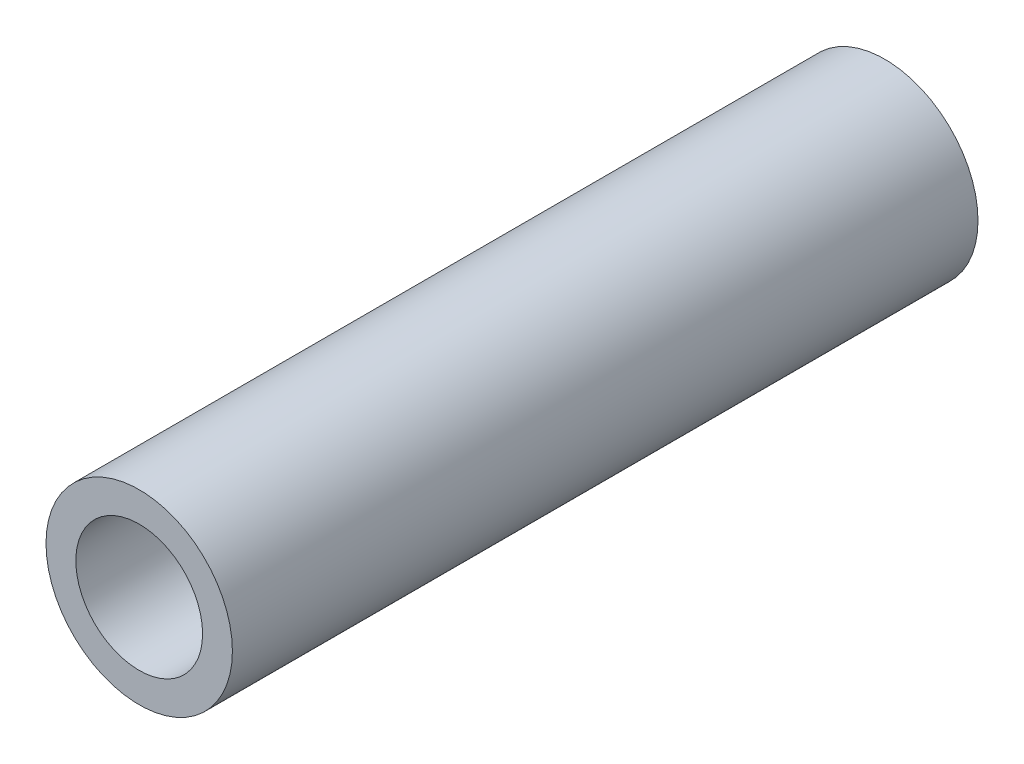
ISO-10303-21;
HEADER;
FILE_DESCRIPTION(('STEP AP214'),'2;1');
FILE_NAME('part.step','',(''),(''),'','','');
FILE_SCHEMA(('AUTOMOTIVE_DESIGN { 1 0 10303 214 1 1 1 1 }'));
ENDSEC;
DATA;
#1=APPLICATION_CONTEXT('core data for automotive mechanical design processes');
#2=APPLICATION_PROTOCOL_DEFINITION('international standard','automotive_design',2000,#1);
#3=PRODUCT_CONTEXT('',#1,'mechanical');
#4=PRODUCT('Part','Part','',(#3));
#5=PRODUCT_RELATED_PRODUCT_CATEGORY('part','',(#4));
#6=PRODUCT_DEFINITION_FORMATION('','',#4);
#7=PRODUCT_DEFINITION_CONTEXT('part definition',#1,'design');
#8=PRODUCT_DEFINITION('design','',#6,#7);
#9=PRODUCT_DEFINITION_SHAPE('','',#8);
#10=(LENGTH_UNIT() NAMED_UNIT(*) SI_UNIT(.MILLI.,.METRE.));
#11=(NAMED_UNIT(*) PLANE_ANGLE_UNIT() SI_UNIT($,.RADIAN.));
#12=(NAMED_UNIT(*) SI_UNIT($,.STERADIAN.) SOLID_ANGLE_UNIT());
#13=UNCERTAINTY_MEASURE_WITH_UNIT(LENGTH_MEASURE(1.E-05),#10,'distance_accuracy_value','');
#14=(GEOMETRIC_REPRESENTATION_CONTEXT(3) GLOBAL_UNCERTAINTY_ASSIGNED_CONTEXT((#13)) GLOBAL_UNIT_ASSIGNED_CONTEXT((#10,
#11,#12)) REPRESENTATION_CONTEXT('',''));
#15=CARTESIAN_POINT('',(0.,0.,0.));
#16=DIRECTION('',(0.,0.,1.));
#17=DIRECTION('',(1.,0.,0.));
#18=AXIS2_PLACEMENT_3D('',#15,#16,#17);
#19=CARTESIAN_POINT('',(0.,0.,20.));
#20=DIRECTION('',(0.,0.,-1.));
#21=DIRECTION('',(-1.,0.,0.));
#22=AXIS2_PLACEMENT_3D('',#19,#20,#21);
#23=CYLINDRICAL_SURFACE('',#22,2.5);
#24=CARTESIAN_POINT('',(0.,0.,20.));
#25=DIRECTION('',(0.,0.,1.));
#26=DIRECTION('',(1.,0.,0.));
#27=AXIS2_PLACEMENT_3D('',#24,#25,#26);
#28=CIRCLE('',#27,2.5);
#29=CARTESIAN_POINT('',(2.5,0.,20.));
#30=VERTEX_POINT('',#29);
#31=EDGE_CURVE('E10',#30,#30,#28,.T.);
#32=ORIENTED_EDGE('',*,*,#31,.F.);
#33=EDGE_LOOP('',(#32));
#34=FACE_BOUND('',#33,.T.);
#35=CARTESIAN_POINT('',(0.,0.,0.));
#36=DIRECTION('',(0.,0.,1.));
#37=DIRECTION('',(1.,0.,0.));
#38=AXIS2_PLACEMENT_3D('',#35,#36,#37);
#39=CIRCLE('',#38,2.5);
#40=CARTESIAN_POINT('',(2.5,0.,0.));
#41=VERTEX_POINT('',#40);
#42=EDGE_CURVE('E49',#41,#41,#39,.T.);
#43=ORIENTED_EDGE('',*,*,#42,.T.);
#44=EDGE_LOOP('',(#43));
#45=FACE_BOUND('',#44,.T.);
#46=ADVANCED_FACE('F41',(#34,#45),#23,.T.);
#47=CARTESIAN_POINT('',(0.,0.,20.));
#48=DIRECTION('',(0.,0.,1.));
#49=DIRECTION('',(1.,0.,0.));
#50=AXIS2_PLACEMENT_3D('',#47,#48,#49);
#51=PLANE('',#50);
#52=CARTESIAN_POINT('',(0.,0.,20.000012));
#53=DIRECTION('',(0.,0.,1.));
#54=DIRECTION('',(1.,0.,0.));
#55=AXIS2_PLACEMENT_3D('',#52,#53,#54);
#56=CIRCLE('',#55,1.7);
#57=CARTESIAN_POINT('',(1.7,0.,20.000012));
#58=VERTEX_POINT('',#57);
#59=EDGE_CURVE('E62',#58,#58,#56,.T.);
#60=ORIENTED_EDGE('',*,*,#59,.F.);
#61=EDGE_LOOP('',(#60));
#62=FACE_BOUND('',#61,.T.);
#63=ORIENTED_EDGE('',*,*,#31,.T.);
#64=EDGE_LOOP('',(#63));
#65=FACE_BOUND('',#64,.T.);
#66=ADVANCED_FACE('F66',(#62,#65),#51,.T.);
#67=CARTESIAN_POINT('',(0.,0.,0.));
#68=DIRECTION('',(0.,0.,1.));
#69=DIRECTION('',(1.,0.,0.));
#70=AXIS2_PLACEMENT_3D('',#67,#68,#69);
#71=PLANE('',#70);
#72=CARTESIAN_POINT('',(0.,0.,0.));
#73=DIRECTION('',(0.,0.,1.));
#74=DIRECTION('',(1.,0.,0.));
#75=AXIS2_PLACEMENT_3D('',#72,#73,#74);
#76=CIRCLE('',#75,1.7);
#77=CARTESIAN_POINT('',(1.7,0.,0.));
#78=VERTEX_POINT('',#77);
#79=EDGE_CURVE('E54',#78,#78,#76,.T.);
#80=ORIENTED_EDGE('',*,*,#79,.T.);
#81=EDGE_LOOP('',(#80));
#82=FACE_BOUND('',#81,.T.);
#83=ORIENTED_EDGE('',*,*,#42,.F.);
#84=EDGE_LOOP('',(#83));
#85=FACE_BOUND('',#84,.T.);
#86=ADVANCED_FACE('F75',(#82,#85),#71,.F.);
#87=CARTESIAN_POINT('',(0.,0.,0.));
#88=DIRECTION('',(0.,0.,1.));
#89=DIRECTION('',(1.,0.,0.));
#90=AXIS2_PLACEMENT_3D('',#87,#88,#89);
#91=CYLINDRICAL_SURFACE('',#90,1.7);
#92=ORIENTED_EDGE('',*,*,#79,.F.);
#93=EDGE_LOOP('',(#92));
#94=FACE_BOUND('',#93,.T.);
#95=ORIENTED_EDGE('',*,*,#59,.T.);
#96=EDGE_LOOP('',(#95));
#97=FACE_BOUND('',#96,.T.);
#98=ADVANCED_FACE('F73',(#94,#97),#91,.F.);
#99=CLOSED_SHELL('',(#46,#66,#86,#98));
#100=MANIFOLD_SOLID_BREP('B2',#99);
#101=ADVANCED_BREP_SHAPE_REPRESENTATION('',(#18,#100),#14);
#102=SHAPE_DEFINITION_REPRESENTATION(#9,#101);
ENDSEC;
END-ISO-10303-21;
